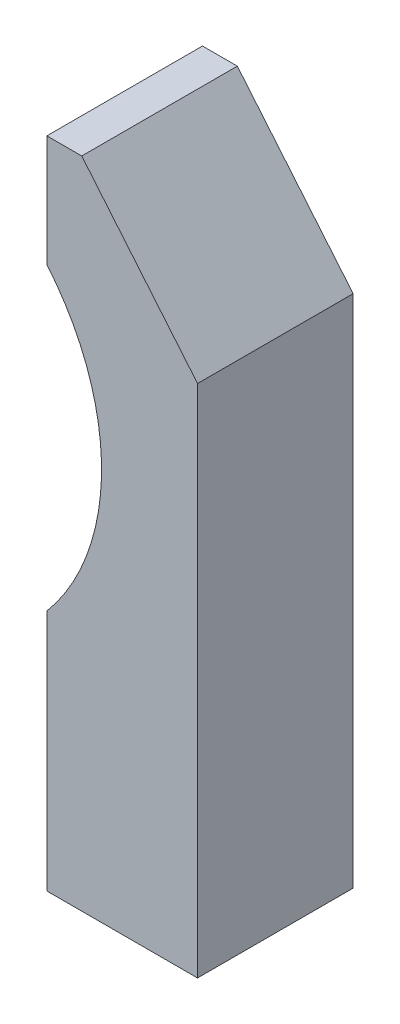
ISO-10303-21;
HEADER;
FILE_DESCRIPTION(('STEP AP214'),'2;1');
FILE_NAME('part.step','',(''),(''),'','','');
FILE_SCHEMA(('AUTOMOTIVE_DESIGN { 1 0 10303 214 1 1 1 1 }'));
ENDSEC;
DATA;
#1=APPLICATION_CONTEXT('core data for automotive mechanical design processes');
#2=APPLICATION_PROTOCOL_DEFINITION('international standard','automotive_design',2000,#1);
#3=PRODUCT_CONTEXT('',#1,'mechanical');
#4=PRODUCT('Part','Part','',(#3));
#5=PRODUCT_RELATED_PRODUCT_CATEGORY('part','',(#4));
#6=PRODUCT_DEFINITION_FORMATION('','',#4);
#7=PRODUCT_DEFINITION_CONTEXT('part definition',#1,'design');
#8=PRODUCT_DEFINITION('design','',#6,#7);
#9=PRODUCT_DEFINITION_SHAPE('','',#8);
#10=(LENGTH_UNIT() NAMED_UNIT(*) SI_UNIT(.MILLI.,.METRE.));
#11=(NAMED_UNIT(*) PLANE_ANGLE_UNIT() SI_UNIT($,.RADIAN.));
#12=(NAMED_UNIT(*) SI_UNIT($,.STERADIAN.) SOLID_ANGLE_UNIT());
#13=UNCERTAINTY_MEASURE_WITH_UNIT(LENGTH_MEASURE(1.E-05),#10,'distance_accuracy_value','');
#14=(GEOMETRIC_REPRESENTATION_CONTEXT(3) GLOBAL_UNCERTAINTY_ASSIGNED_CONTEXT((#13)) GLOBAL_UNIT_ASSIGNED_CONTEXT((#10,
#11,#12)) REPRESENTATION_CONTEXT('',''));
#15=CARTESIAN_POINT('',(0.,0.,0.));
#16=DIRECTION('',(0.,0.,1.));
#17=DIRECTION('',(1.,0.,0.));
#18=AXIS2_PLACEMENT_3D('',#15,#16,#17);
#19=CARTESIAN_POINT('',(0.,0.,33.02));
#20=DIRECTION('',(1.,0.,0.));
#21=DIRECTION('',(0.,0.,-1.));
#22=AXIS2_PLACEMENT_3D('',#19,#20,#21);
#23=PLANE('',#22);
#24=DIRECTION('',(0.,-1.,0.));
#25=VECTOR('',#24,1.);
#26=CARTESIAN_POINT('',(0.,0.,0.));
#27=LINE('',#26,#25);
#28=CARTESIAN_POINT('',(0.,51.4591661865502,0.));
#29=VERTEX_POINT('',#28);
#30=CARTESIAN_POINT('',(0.,0.,0.));
#31=VERTEX_POINT('',#30);
#32=EDGE_CURVE('E129',#29,#31,#27,.T.);
#33=ORIENTED_EDGE('',*,*,#32,.T.);
#34=DIRECTION('',(0.,0.,-1.));
#35=VECTOR('',#34,1.);
#36=CARTESIAN_POINT('',(0.,0.,33.02));
#37=LINE('',#36,#35);
#38=CARTESIAN_POINT('',(0.,0.,33.02));
#39=VERTEX_POINT('',#38);
#40=EDGE_CURVE('E11',#39,#31,#37,.T.);
#41=ORIENTED_EDGE('',*,*,#40,.F.);
#42=DIRECTION('',(0.,-1.,0.));
#43=VECTOR('',#42,1.);
#44=CARTESIAN_POINT('',(0.,0.,33.02));
#45=LINE('',#44,#43);
#46=CARTESIAN_POINT('',(0.,51.4591661865502,33.02));
#47=VERTEX_POINT('',#46);
#48=EDGE_CURVE('E141',#47,#39,#45,.T.);
#49=ORIENTED_EDGE('',*,*,#48,.F.);
#50=DIRECTION('',(0.,0.,-1.));
#51=VECTOR('',#50,1.);
#52=CARTESIAN_POINT('',(0.,51.4591661865502,33.02));
#53=LINE('',#52,#51);
#54=EDGE_CURVE('E125',#47,#29,#53,.T.);
#55=ORIENTED_EDGE('',*,*,#54,.T.);
#56=EDGE_LOOP('',(#33,#41,#49,#55));
#57=FACE_BOUND('',#56,.T.);
#58=ADVANCED_FACE('F39',(#57),#23,.F.);
#59=CARTESIAN_POINT('',(0.,0.,33.02));
#60=DIRECTION('',(0.,1.,0.));
#61=DIRECTION('',(0.,0.,1.));
#62=AXIS2_PLACEMENT_3D('',#59,#60,#61);
#63=PLANE('',#62);
#64=DIRECTION('',(1.,0.,0.));
#65=VECTOR('',#64,1.);
#66=CARTESIAN_POINT('',(0.,0.,0.));
#67=LINE('',#66,#65);
#68=CARTESIAN_POINT('',(31.968493198344,0.,0.));
#69=VERTEX_POINT('',#68);
#70=EDGE_CURVE('E132',#31,#69,#67,.T.);
#71=ORIENTED_EDGE('',*,*,#70,.T.);
#72=DIRECTION('',(0.,0.,-1.));
#73=VECTOR('',#72,1.);
#74=CARTESIAN_POINT('',(31.968493198344,0.,33.02));
#75=LINE('',#74,#73);
#76=CARTESIAN_POINT('',(31.968493198344,0.,33.02));
#77=VERTEX_POINT('',#76);
#78=EDGE_CURVE('E47',#77,#69,#75,.T.);
#79=ORIENTED_EDGE('',*,*,#78,.F.);
#80=DIRECTION('',(1.,0.,0.));
#81=VECTOR('',#80,1.);
#82=CARTESIAN_POINT('',(0.,0.,33.02));
#83=LINE('',#82,#81);
#84=EDGE_CURVE('E95',#39,#77,#83,.T.);
#85=ORIENTED_EDGE('',*,*,#84,.F.);
#86=ORIENTED_EDGE('',*,*,#40,.T.);
#87=EDGE_LOOP('',(#71,#79,#85,#86));
#88=FACE_BOUND('',#87,.T.);
#89=ADVANCED_FACE('F166',(#88),#63,.F.);
#90=CARTESIAN_POINT('',(31.968493198344,0.,33.02));
#91=DIRECTION('',(-1.,0.,0.));
#92=DIRECTION('',(0.,0.,1.));
#93=AXIS2_PLACEMENT_3D('',#90,#91,#92);
#94=PLANE('',#93);
#95=DIRECTION('',(0.,1.,0.));
#96=VECTOR('',#95,1.);
#97=CARTESIAN_POINT('',(31.968493198344,0.,0.));
#98=LINE('',#97,#96);
#99=CARTESIAN_POINT('',(31.968493198344,109.242995924672,0.));
#100=VERTEX_POINT('',#99);
#101=EDGE_CURVE('E134',#69,#100,#98,.T.);
#102=ORIENTED_EDGE('',*,*,#101,.T.);
#103=DIRECTION('',(0.,0.,-1.));
#104=VECTOR('',#103,1.);
#105=CARTESIAN_POINT('',(31.968493198344,109.242995924672,33.02));
#106=LINE('',#105,#104);
#107=CARTESIAN_POINT('',(31.968493198344,109.242995924672,33.02));
#108=VERTEX_POINT('',#107);
#109=EDGE_CURVE('E145',#108,#100,#106,.T.);
#110=ORIENTED_EDGE('',*,*,#109,.F.);
#111=DIRECTION('',(0.,1.,0.));
#112=VECTOR('',#111,1.);
#113=CARTESIAN_POINT('',(31.968493198344,0.,33.02));
#114=LINE('',#113,#112);
#115=EDGE_CURVE('E153',#77,#108,#114,.T.);
#116=ORIENTED_EDGE('',*,*,#115,.F.);
#117=ORIENTED_EDGE('',*,*,#78,.T.);
#118=EDGE_LOOP('',(#102,#110,#116,#117));
#119=FACE_BOUND('',#118,.T.);
#120=ADVANCED_FACE('F151',(#119),#94,.F.);
#121=CARTESIAN_POINT('',(7.39929494235012,138.771204315703,33.02));
#122=DIRECTION('',(-0.76870299461375,-0.639605899028342,0.));
#123=DIRECTION('',(0.639605899028342,-0.76870299461375,0.));
#124=AXIS2_PLACEMENT_3D('',#121,#122,#123);
#125=PLANE('',#124);
#126=DIRECTION('',(-0.639605899028342,0.76870299461375,0.));
#127=VECTOR('',#126,1.);
#128=CARTESIAN_POINT('',(7.39929494235012,138.771204315703,0.));
#129=LINE('',#128,#127);
#130=CARTESIAN_POINT('',(7.39929494235012,138.771204315703,0.));
#131=VERTEX_POINT('',#130);
#132=EDGE_CURVE('E136',#100,#131,#129,.T.);
#133=ORIENTED_EDGE('',*,*,#132,.T.);
#134=DIRECTION('',(0.,0.,-1.));
#135=VECTOR('',#134,1.);
#136=CARTESIAN_POINT('',(7.39929494235012,138.771204315703,33.02));
#137=LINE('',#136,#135);
#138=CARTESIAN_POINT('',(7.39929494235012,138.771204315703,33.02));
#139=VERTEX_POINT('',#138);
#140=EDGE_CURVE('E120',#139,#131,#137,.T.);
#141=ORIENTED_EDGE('',*,*,#140,.F.);
#142=DIRECTION('',(-0.639605899028342,0.76870299461375,0.));
#143=VECTOR('',#142,1.);
#144=CARTESIAN_POINT('',(7.39929494235012,138.771204315703,33.02));
#145=LINE('',#144,#143);
#146=EDGE_CURVE('E111',#108,#139,#145,.T.);
#147=ORIENTED_EDGE('',*,*,#146,.F.);
#148=ORIENTED_EDGE('',*,*,#109,.T.);
#149=EDGE_LOOP('',(#133,#141,#147,#148));
#150=FACE_BOUND('',#149,.T.);
#151=ADVANCED_FACE('F159',(#150),#125,.F.);
#152=CARTESIAN_POINT('',(0.,138.771204315703,33.02));
#153=DIRECTION('',(0.,-1.,0.));
#154=DIRECTION('',(0.,0.,-1.));
#155=AXIS2_PLACEMENT_3D('',#152,#153,#154);
#156=PLANE('',#155);
#157=DIRECTION('',(-1.,0.,0.));
#158=VECTOR('',#157,1.);
#159=CARTESIAN_POINT('',(0.,138.771204315703,0.));
#160=LINE('',#159,#158);
#161=CARTESIAN_POINT('',(0.,138.771204315703,0.));
#162=VERTEX_POINT('',#161);
#163=EDGE_CURVE('E119',#131,#162,#160,.T.);
#164=ORIENTED_EDGE('',*,*,#163,.T.);
#165=DIRECTION('',(0.,0.,-1.));
#166=VECTOR('',#165,1.);
#167=CARTESIAN_POINT('',(0.,138.771204315703,33.02));
#168=LINE('',#167,#166);
#169=CARTESIAN_POINT('',(0.,138.771204315703,33.02));
#170=VERTEX_POINT('',#169);
#171=EDGE_CURVE('E116',#170,#162,#168,.T.);
#172=ORIENTED_EDGE('',*,*,#171,.F.);
#173=DIRECTION('',(-1.,0.,0.));
#174=VECTOR('',#173,1.);
#175=CARTESIAN_POINT('',(0.,138.771204315703,33.02));
#176=LINE('',#175,#174);
#177=EDGE_CURVE('E105',#139,#170,#176,.T.);
#178=ORIENTED_EDGE('',*,*,#177,.F.);
#179=ORIENTED_EDGE('',*,*,#140,.T.);
#180=EDGE_LOOP('',(#164,#172,#178,#179));
#181=FACE_BOUND('',#180,.T.);
#182=ADVANCED_FACE('F117',(#181),#156,.F.);
#183=CARTESIAN_POINT('',(0.,115.106808600282,33.02));
#184=DIRECTION('',(1.,0.,0.));
#185=DIRECTION('',(0.,0.,-1.));
#186=AXIS2_PLACEMENT_3D('',#183,#184,#185);
#187=PLANE('',#186);
#188=DIRECTION('',(0.,-1.,0.));
#189=VECTOR('',#188,1.);
#190=CARTESIAN_POINT('',(0.,115.106808600282,0.));
#191=LINE('',#190,#189);
#192=CARTESIAN_POINT('',(0.,115.106808600282,0.));
#193=VERTEX_POINT('',#192);
#194=EDGE_CURVE('E81',#162,#193,#191,.T.);
#195=ORIENTED_EDGE('',*,*,#194,.T.);
#196=DIRECTION('',(0.,0.,-1.));
#197=VECTOR('',#196,1.);
#198=CARTESIAN_POINT('',(0.,115.106808600282,33.02));
#199=LINE('',#198,#197);
#200=CARTESIAN_POINT('',(0.,115.106808600282,33.02));
#201=VERTEX_POINT('',#200);
#202=EDGE_CURVE('E121',#201,#193,#199,.T.);
#203=ORIENTED_EDGE('',*,*,#202,.F.);
#204=DIRECTION('',(0.,-1.,0.));
#205=VECTOR('',#204,1.);
#206=CARTESIAN_POINT('',(0.,115.106808600282,33.02));
#207=LINE('',#206,#205);
#208=EDGE_CURVE('E109',#170,#201,#207,.T.);
#209=ORIENTED_EDGE('',*,*,#208,.F.);
#210=ORIENTED_EDGE('',*,*,#171,.T.);
#211=EDGE_LOOP('',(#195,#203,#209,#210));
#212=FACE_BOUND('',#211,.T.);
#213=ADVANCED_FACE('F123',(#212),#187,.F.);
#214=CARTESIAN_POINT('',(-37.8268405811669,83.282987393416,33.02));
#215=DIRECTION('',(0.,0.,-1.));
#216=DIRECTION('',(-1.,0.,0.));
#217=AXIS2_PLACEMENT_3D('',#214,#215,#216);
#218=CYLINDRICAL_SURFACE('',#217,49.4330402115789);
#219=CARTESIAN_POINT('',(-37.8268405811669,83.282987393416,0.));
#220=DIRECTION('',(0.,0.,-1.));
#221=DIRECTION('',(1.,0.,0.));
#222=AXIS2_PLACEMENT_3D('',#219,#220,#221);
#223=CIRCLE('',#222,49.4330402115789);
#224=EDGE_CURVE('E87',#193,#29,#223,.T.);
#225=ORIENTED_EDGE('',*,*,#224,.T.);
#226=ORIENTED_EDGE('',*,*,#54,.F.);
#227=CARTESIAN_POINT('',(-37.8268405811669,83.282987393416,33.02));
#228=DIRECTION('',(0.,0.,-1.));
#229=DIRECTION('',(1.,0.,0.));
#230=AXIS2_PLACEMENT_3D('',#227,#228,#229);
#231=CIRCLE('',#230,49.4330402115789);
#232=EDGE_CURVE('E55',#201,#47,#231,.T.);
#233=ORIENTED_EDGE('',*,*,#232,.F.);
#234=ORIENTED_EDGE('',*,*,#202,.T.);
#235=EDGE_LOOP('',(#225,#226,#233,#234));
#236=FACE_BOUND('',#235,.T.);
#237=ADVANCED_FACE('F180',(#236),#218,.F.);
#238=CARTESIAN_POINT('',(-37.8268405811669,83.282987393416,33.02));
#239=DIRECTION('',(0.,0.,1.));
#240=DIRECTION('',(1.,0.,0.));
#241=AXIS2_PLACEMENT_3D('',#238,#239,#240);
#242=PLANE('',#241);
#243=ORIENTED_EDGE('',*,*,#48,.T.);
#244=ORIENTED_EDGE('',*,*,#84,.T.);
#245=ORIENTED_EDGE('',*,*,#115,.T.);
#246=ORIENTED_EDGE('',*,*,#146,.T.);
#247=ORIENTED_EDGE('',*,*,#177,.T.);
#248=ORIENTED_EDGE('',*,*,#208,.T.);
#249=ORIENTED_EDGE('',*,*,#232,.T.);
#250=EDGE_LOOP('',(#243,#244,#245,#246,#247,#248,#249));
#251=FACE_BOUND('',#250,.T.);
#252=ADVANCED_FACE('F107',(#251),#242,.T.);
#253=CARTESIAN_POINT('',(-37.8268405811669,83.282987393416,0.));
#254=DIRECTION('',(0.,0.,1.));
#255=DIRECTION('',(1.,0.,0.));
#256=AXIS2_PLACEMENT_3D('',#253,#254,#255);
#257=PLANE('',#256);
#258=ORIENTED_EDGE('',*,*,#32,.F.);
#259=ORIENTED_EDGE('',*,*,#224,.F.);
#260=ORIENTED_EDGE('',*,*,#194,.F.);
#261=ORIENTED_EDGE('',*,*,#163,.F.);
#262=ORIENTED_EDGE('',*,*,#132,.F.);
#263=ORIENTED_EDGE('',*,*,#101,.F.);
#264=ORIENTED_EDGE('',*,*,#70,.F.);
#265=EDGE_LOOP('',(#258,#259,#260,#261,#262,#263,#264));
#266=FACE_BOUND('',#265,.T.);
#267=ADVANCED_FACE('F157',(#266),#257,.F.);
#268=CLOSED_SHELL('',(#58,#89,#120,#151,#182,#213,#237,#252,#267));
#269=MANIFOLD_SOLID_BREP('B2',#268);
#270=ADVANCED_BREP_SHAPE_REPRESENTATION('',(#18,#269),#14);
#271=SHAPE_DEFINITION_REPRESENTATION(#9,#270);
ENDSEC;
END-ISO-10303-21;
